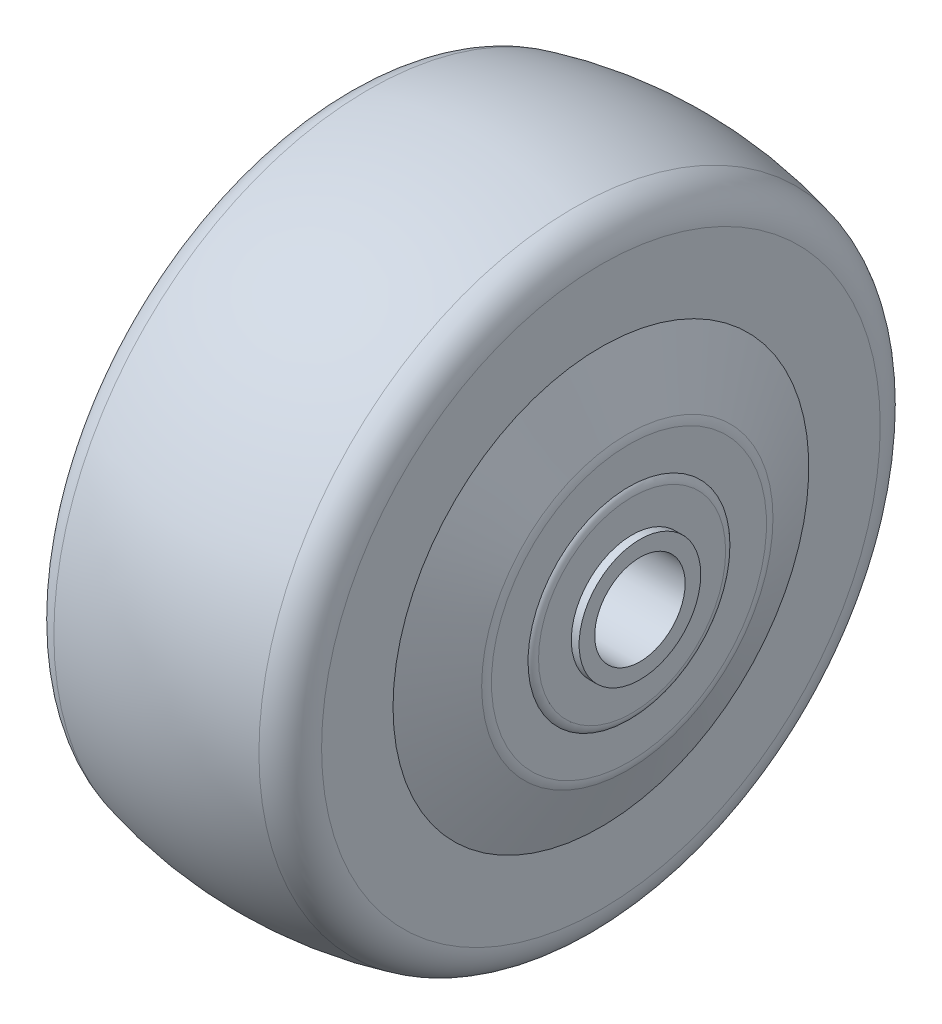
ISO-10303-21;
HEADER;
FILE_DESCRIPTION(('STEP AP214'),'2;1');
FILE_NAME('part.step','',(''),(''),'','','');
FILE_SCHEMA(('AUTOMOTIVE_DESIGN { 1 0 10303 214 1 1 1 1 }'));
ENDSEC;
DATA;
#1=APPLICATION_CONTEXT('core data for automotive mechanical design processes');
#2=APPLICATION_PROTOCOL_DEFINITION('international standard','automotive_design',2000,#1);
#3=PRODUCT_CONTEXT('',#1,'mechanical');
#4=PRODUCT('Part','Part','',(#3));
#5=PRODUCT_RELATED_PRODUCT_CATEGORY('part','',(#4));
#6=PRODUCT_DEFINITION_FORMATION('','',#4);
#7=PRODUCT_DEFINITION_CONTEXT('part definition',#1,'design');
#8=PRODUCT_DEFINITION('design','',#6,#7);
#9=PRODUCT_DEFINITION_SHAPE('','',#8);
#10=(LENGTH_UNIT() NAMED_UNIT(*) SI_UNIT(.MILLI.,.METRE.));
#11=(NAMED_UNIT(*) PLANE_ANGLE_UNIT() SI_UNIT($,.RADIAN.));
#12=(NAMED_UNIT(*) SI_UNIT($,.STERADIAN.) SOLID_ANGLE_UNIT());
#13=UNCERTAINTY_MEASURE_WITH_UNIT(LENGTH_MEASURE(1.E-05),#10,'distance_accuracy_value','');
#14=(GEOMETRIC_REPRESENTATION_CONTEXT(3) GLOBAL_UNCERTAINTY_ASSIGNED_CONTEXT((#13)) GLOBAL_UNIT_ASSIGNED_CONTEXT((#10,
#11,#12)) REPRESENTATION_CONTEXT('',''));
#15=CARTESIAN_POINT('',(0.,0.,0.));
#16=DIRECTION('',(0.,0.,1.));
#17=DIRECTION('',(1.,0.,0.));
#18=AXIS2_PLACEMENT_3D('',#15,#16,#17);
#19=CARTESIAN_POINT('',(-17.87209777356,0.,0.));
#20=DIRECTION('',(1.,0.,0.));
#21=DIRECTION('',(0.,0.,-1.));
#22=AXIS2_PLACEMENT_3D('',#19,#20,#21);
#23=CYLINDRICAL_SURFACE('',#22,4.35);
#24=CARTESIAN_POINT('',(16.25290222644,0.,0.));
#25=DIRECTION('',(1.,0.,0.));
#26=DIRECTION('',(0.,0.,-1.));
#27=AXIS2_PLACEMENT_3D('',#24,#25,#26);
#28=CIRCLE('',#27,4.35);
#29=CARTESIAN_POINT('',(16.25290222644,0.,-4.35));
#30=VERTEX_POINT('',#29);
#31=EDGE_CURVE('E357',#30,#30,#28,.F.);
#32=ORIENTED_EDGE('',*,*,#31,.F.);
#33=EDGE_LOOP('',(#32));
#34=FACE_BOUND('',#33,.T.);
#35=CARTESIAN_POINT('',(-16.24709777356,0.,0.));
#36=DIRECTION('',(1.,0.,0.));
#37=DIRECTION('',(0.,0.,-1.));
#38=AXIS2_PLACEMENT_3D('',#35,#36,#37);
#39=CIRCLE('',#38,4.35);
#40=CARTESIAN_POINT('',(-16.24709777356,0.,-4.35));
#41=VERTEX_POINT('',#40);
#42=EDGE_CURVE('E359',#41,#41,#39,.F.);
#43=ORIENTED_EDGE('',*,*,#42,.T.);
#44=EDGE_LOOP('',(#43));
#45=FACE_BOUND('',#44,.T.);
#46=ADVANCED_FACE('F17',(#34,#45),#23,.F.);
#47=CARTESIAN_POINT('',(-16.24709777356,0.,0.));
#48=DIRECTION('',(1.,0.,0.));
#49=DIRECTION('',(0.,0.,-1.));
#50=AXIS2_PLACEMENT_3D('',#47,#48,#49);
#51=PLANE('',#50);
#52=ORIENTED_EDGE('',*,*,#42,.F.);
#53=EDGE_LOOP('',(#52));
#54=FACE_BOUND('',#53,.T.);
#55=CARTESIAN_POINT('',(-16.24709777356,0.,0.));
#56=DIRECTION('',(1.,0.,0.));
#57=DIRECTION('',(0.,0.,-1.));
#58=AXIS2_PLACEMENT_3D('',#55,#56,#57);
#59=CIRCLE('',#58,5.85);
#60=CARTESIAN_POINT('',(-16.24709777356,0.,-5.85));
#61=VERTEX_POINT('',#60);
#62=EDGE_CURVE('E354',#61,#61,#59,.T.);
#63=ORIENTED_EDGE('',*,*,#62,.F.);
#64=EDGE_LOOP('',(#63));
#65=FACE_BOUND('',#64,.T.);
#66=ADVANCED_FACE('F165',(#54,#65),#51,.F.);
#67=CARTESIAN_POINT('',(16.25290222644,0.,0.));
#68=DIRECTION('',(1.,0.,0.));
#69=DIRECTION('',(0.,0.,-1.));
#70=AXIS2_PLACEMENT_3D('',#67,#68,#69);
#71=PLANE('',#70);
#72=ORIENTED_EDGE('',*,*,#31,.T.);
#73=EDGE_LOOP('',(#72));
#74=FACE_BOUND('',#73,.T.);
#75=CARTESIAN_POINT('',(16.25290222644,0.,0.));
#76=DIRECTION('',(1.,0.,0.));
#77=DIRECTION('',(0.,0.,-1.));
#78=AXIS2_PLACEMENT_3D('',#75,#76,#77);
#79=CIRCLE('',#78,5.85);
#80=CARTESIAN_POINT('',(16.25290222644,0.,-5.85));
#81=VERTEX_POINT('',#80);
#82=EDGE_CURVE('E351',#81,#81,#79,.F.);
#83=ORIENTED_EDGE('',*,*,#82,.F.);
#84=EDGE_LOOP('',(#83));
#85=FACE_BOUND('',#84,.T.);
#86=ADVANCED_FACE('F161',(#74,#85),#71,.T.);
#87=CARTESIAN_POINT('',(-17.87209777356,0.,0.));
#88=DIRECTION('',(1.,0.,0.));
#89=DIRECTION('',(0.,0.,-1.));
#90=AXIS2_PLACEMENT_3D('',#87,#88,#89);
#91=CYLINDRICAL_SURFACE('',#90,5.85);
#92=ORIENTED_EDGE('',*,*,#62,.T.);
#93=EDGE_LOOP('',(#92));
#94=FACE_BOUND('',#93,.T.);
#95=CARTESIAN_POINT('',(-15.5,0.,0.));
#96=DIRECTION('',(1.,0.,0.));
#97=DIRECTION('',(0.,0.,-1.));
#98=AXIS2_PLACEMENT_3D('',#95,#96,#97);
#99=CIRCLE('',#98,5.85);
#100=CARTESIAN_POINT('',(-15.5,0.,-5.85));
#101=VERTEX_POINT('',#100);
#102=EDGE_CURVE('E348',#101,#101,#99,.F.);
#103=ORIENTED_EDGE('',*,*,#102,.T.);
#104=EDGE_LOOP('',(#103));
#105=FACE_BOUND('',#104,.T.);
#106=ADVANCED_FACE('F157',(#94,#105),#91,.T.);
#107=CARTESIAN_POINT('',(-17.87209777356,0.,0.));
#108=DIRECTION('',(1.,0.,0.));
#109=DIRECTION('',(0.,0.,-1.));
#110=AXIS2_PLACEMENT_3D('',#107,#108,#109);
#111=CYLINDRICAL_SURFACE('',#110,5.85);
#112=CARTESIAN_POINT('',(15.5,0.,0.));
#113=DIRECTION('',(1.,0.,0.));
#114=DIRECTION('',(0.,0.,-1.));
#115=AXIS2_PLACEMENT_3D('',#112,#113,#114);
#116=CIRCLE('',#115,5.85);
#117=CARTESIAN_POINT('',(15.5,0.,-5.85));
#118=VERTEX_POINT('',#117);
#119=EDGE_CURVE('E74',#118,#118,#116,.F.);
#120=ORIENTED_EDGE('',*,*,#119,.F.);
#121=EDGE_LOOP('',(#120));
#122=FACE_BOUND('',#121,.T.);
#123=ORIENTED_EDGE('',*,*,#82,.T.);
#124=EDGE_LOOP('',(#123));
#125=FACE_BOUND('',#124,.T.);
#126=ADVANCED_FACE('F152',(#122,#125),#111,.T.);
#127=CARTESIAN_POINT('',(-15.5,0.,0.));
#128=DIRECTION('',(1.,0.,0.));
#129=DIRECTION('',(0.,0.,-1.));
#130=AXIS2_PLACEMENT_3D('',#127,#128,#129);
#131=PLANE('',#130);
#132=ORIENTED_EDGE('',*,*,#102,.F.);
#133=EDGE_LOOP('',(#132));
#134=FACE_BOUND('',#133,.T.);
#135=CARTESIAN_POINT('',(-15.5,0.,0.));
#136=DIRECTION('',(1.,0.,0.));
#137=DIRECTION('',(0.,-1.,0.));
#138=AXIS2_PLACEMENT_3D('',#135,#136,#137);
#139=CIRCLE('',#138,8.999999999983);
#140=CARTESIAN_POINT('',(-15.5,-8.9999999999817,0.));
#141=VERTEX_POINT('',#140);
#142=CARTESIAN_POINT('',(-15.5,8.9999999999817,0.));
#143=VERTEX_POINT('',#142);
#144=EDGE_CURVE('E72',#141,#143,#139,.T.);
#145=ORIENTED_EDGE('',*,*,#144,.F.);
#146=CARTESIAN_POINT('',(-15.5,0.,0.));
#147=DIRECTION('',(1.,0.,0.));
#148=DIRECTION('',(0.,1.,0.));
#149=AXIS2_PLACEMENT_3D('',#146,#147,#148);
#150=CIRCLE('',#149,8.999999999983);
#151=EDGE_CURVE('E67',#143,#141,#150,.T.);
#152=ORIENTED_EDGE('',*,*,#151,.F.);
#153=EDGE_LOOP('',(#145,#152));
#154=FACE_BOUND('',#153,.T.);
#155=ADVANCED_FACE('F71',(#134,#154),#131,.F.);
#156=CARTESIAN_POINT('',(15.5,0.,0.));
#157=DIRECTION('',(1.,0.,0.));
#158=DIRECTION('',(0.,0.,-1.));
#159=AXIS2_PLACEMENT_3D('',#156,#157,#158);
#160=PLANE('',#159);
#161=ORIENTED_EDGE('',*,*,#119,.T.);
#162=EDGE_LOOP('',(#161));
#163=FACE_BOUND('',#162,.T.);
#164=CARTESIAN_POINT('',(15.499999999997,0.,0.));
#165=DIRECTION('',(-1.,0.,0.));
#166=DIRECTION('',(0.,1.,0.));
#167=AXIS2_PLACEMENT_3D('',#164,#165,#166);
#168=CIRCLE('',#167,8.99999999982);
#169=CARTESIAN_POINT('',(15.4999999999982,8.9999999998252,0.));
#170=VERTEX_POINT('',#169);
#171=CARTESIAN_POINT('',(15.4999999999982,-8.9999999998252,0.));
#172=VERTEX_POINT('',#171);
#173=EDGE_CURVE('E114',#170,#172,#168,.T.);
#174=ORIENTED_EDGE('',*,*,#173,.F.);
#175=CARTESIAN_POINT('',(15.499999999997,0.,0.));
#176=DIRECTION('',(-1.,0.,0.));
#177=DIRECTION('',(0.,-1.,0.));
#178=AXIS2_PLACEMENT_3D('',#175,#176,#177);
#179=CIRCLE('',#178,8.99999999982);
#180=EDGE_CURVE('E80',#172,#170,#179,.T.);
#181=ORIENTED_EDGE('',*,*,#180,.F.);
#182=EDGE_LOOP('',(#174,#181));
#183=FACE_BOUND('',#182,.T.);
#184=ADVANCED_FACE('F101',(#163,#183),#160,.T.);
#185=CARTESIAN_POINT('',(-14.49999999997,0.,0.));
#186=DIRECTION('',(1.,0.,0.));
#187=DIRECTION('',(0.,-1.,0.));
#188=AXIS2_PLACEMENT_3D('',#185,#186,#187);
#189=TOROIDAL_SURFACE('',#188,8.99999999997,1.00000000003);
#190=ORIENTED_EDGE('',*,*,#151,.T.);
#191=ORIENTED_EDGE('',*,*,#144,.T.);
#192=EDGE_LOOP('',(#190,#191));
#193=FACE_BOUND('',#192,.T.);
#194=CARTESIAN_POINT('',(-15.2,0.,0.));
#195=DIRECTION('',(1.,0.,0.));
#196=DIRECTION('',(0.,0.,-1.));
#197=AXIS2_PLACEMENT_3D('',#194,#195,#196);
#198=CIRCLE('',#197,9.71414284283689);
#199=CARTESIAN_POINT('',(-15.2,0.,-9.71414284283689));
#200=VERTEX_POINT('',#199);
#201=EDGE_CURVE('E339',#200,#200,#198,.F.);
#202=ORIENTED_EDGE('',*,*,#201,.T.);
#203=EDGE_LOOP('',(#202));
#204=FACE_BOUND('',#203,.T.);
#205=ADVANCED_FACE('F78',(#193,#204),#189,.T.);
#206=CARTESIAN_POINT('',(14.49999999987,0.,0.));
#207=DIRECTION('',(1.,0.,0.));
#208=DIRECTION('',(0.,-1.,0.));
#209=AXIS2_PLACEMENT_3D('',#206,#207,#208);
#210=TOROIDAL_SURFACE('',#209,8.999999999872,1.000000000127);
#211=CARTESIAN_POINT('',(15.2,0.,0.));
#212=DIRECTION('',(1.,0.,0.));
#213=DIRECTION('',(0.,0.,-1.));
#214=AXIS2_PLACEMENT_3D('',#211,#212,#213);
#215=CIRCLE('',#214,9.71414284277669);
#216=CARTESIAN_POINT('',(15.2,0.,-9.71414284277669));
#217=VERTEX_POINT('',#216);
#218=EDGE_CURVE('E337',#217,#217,#215,.F.);
#219=ORIENTED_EDGE('',*,*,#218,.F.);
#220=EDGE_LOOP('',(#219));
#221=FACE_BOUND('',#220,.T.);
#222=ORIENTED_EDGE('',*,*,#173,.T.);
#223=ORIENTED_EDGE('',*,*,#180,.T.);
#224=EDGE_LOOP('',(#222,#223));
#225=FACE_BOUND('',#224,.T.);
#226=ADVANCED_FACE('F100',(#221,#225),#210,.T.);
#227=CARTESIAN_POINT('',(-15.2,0.,0.));
#228=DIRECTION('',(1.,0.,0.));
#229=DIRECTION('',(0.,0.,-1.));
#230=AXIS2_PLACEMENT_3D('',#227,#228,#229);
#231=PLANE('',#230);
#232=ORIENTED_EDGE('',*,*,#201,.F.);
#233=EDGE_LOOP('',(#232));
#234=FACE_BOUND('',#233,.T.);
#235=CARTESIAN_POINT('',(-15.200000000005,0.,0.));
#236=DIRECTION('',(1.,0.,0.));
#237=DIRECTION('',(0.,-1.,0.));
#238=AXIS2_PLACEMENT_3D('',#235,#236,#237);
#239=CIRCLE('',#238,13.23229401321);
#240=CARTESIAN_POINT('',(-15.200000000003,-13.232294013189,0.));
#241=VERTEX_POINT('',#240);
#242=CARTESIAN_POINT('',(-15.200000000003,13.232294013189,0.));
#243=VERTEX_POINT('',#242);
#244=EDGE_CURVE('E309',#241,#243,#239,.T.);
#245=ORIENTED_EDGE('',*,*,#244,.F.);
#246=CARTESIAN_POINT('',(-15.200000000005,0.,0.));
#247=DIRECTION('',(1.,0.,0.));
#248=DIRECTION('',(0.,1.,0.));
#249=AXIS2_PLACEMENT_3D('',#246,#247,#248);
#250=CIRCLE('',#249,13.23229401321);
#251=EDGE_CURVE('E319',#243,#241,#250,.T.);
#252=ORIENTED_EDGE('',*,*,#251,.F.);
#253=EDGE_LOOP('',(#245,#252));
#254=FACE_BOUND('',#253,.T.);
#255=ADVANCED_FACE('F285',(#234,#254),#231,.F.);
#256=CARTESIAN_POINT('',(15.2,0.,0.));
#257=DIRECTION('',(1.,0.,0.));
#258=DIRECTION('',(0.,0.,-1.));
#259=AXIS2_PLACEMENT_3D('',#256,#257,#258);
#260=PLANE('',#259);
#261=ORIENTED_EDGE('',*,*,#218,.T.);
#262=EDGE_LOOP('',(#261));
#263=FACE_BOUND('',#262,.T.);
#264=CARTESIAN_POINT('',(15.199999999995,0.,0.));
#265=DIRECTION('',(-1.,0.,0.));
#266=DIRECTION('',(0.,1.,0.));
#267=AXIS2_PLACEMENT_3D('',#264,#265,#266);
#268=CIRCLE('',#267,13.232294013);
#269=CARTESIAN_POINT('',(15.199999999997,13.232294013,0.));
#270=VERTEX_POINT('',#269);
#271=CARTESIAN_POINT('',(15.199999999997,-13.232294013,0.));
#272=VERTEX_POINT('',#271);
#273=EDGE_CURVE('E268',#270,#272,#268,.T.);
#274=ORIENTED_EDGE('',*,*,#273,.F.);
#275=CARTESIAN_POINT('',(15.199999999995,0.,0.));
#276=DIRECTION('',(-1.,0.,0.));
#277=DIRECTION('',(0.,-1.,0.));
#278=AXIS2_PLACEMENT_3D('',#275,#276,#277);
#279=CIRCLE('',#278,13.232294013);
#280=EDGE_CURVE('E235',#272,#270,#279,.T.);
#281=ORIENTED_EDGE('',*,*,#280,.F.);
#282=EDGE_LOOP('',(#274,#281));
#283=FACE_BOUND('',#282,.T.);
#284=ADVANCED_FACE('F277',(#263,#283),#260,.T.);
#285=CARTESIAN_POINT('',(-13.19999999796,0.,0.));
#286=DIRECTION('',(1.,0.,0.));
#287=DIRECTION('',(0.,-1.,0.));
#288=AXIS2_PLACEMENT_3D('',#285,#286,#287);
#289=TOROIDAL_SURFACE('',#288,13.232294013,2.000000002045);
#290=ORIENTED_EDGE('',*,*,#251,.T.);
#291=ORIENTED_EDGE('',*,*,#244,.T.);
#292=EDGE_LOOP('',(#290,#291));
#293=FACE_BOUND('',#292,.T.);
#294=CARTESIAN_POINT('',(-15.0410097065829,0.,0.));
#295=DIRECTION('',(1.,0.,0.));
#296=DIRECTION('',(0.,-1.,0.));
#297=AXIS2_PLACEMENT_3D('',#294,#295,#296);
#298=CIRCLE('',#297,14.0137562711712);
#299=CARTESIAN_POINT('',(-15.0410097065829,-14.0137562711712,0.));
#300=VERTEX_POINT('',#299);
#301=EDGE_CURVE('E266',#300,#300,#298,.T.);
#302=ORIENTED_EDGE('',*,*,#301,.F.);
#303=EDGE_LOOP('',(#302));
#304=FACE_BOUND('',#303,.T.);
#305=ADVANCED_FACE('F253',(#293,#304),#289,.T.);
#306=CARTESIAN_POINT('',(13.19999999795,0.,0.));
#307=DIRECTION('',(1.,0.,0.));
#308=DIRECTION('',(0.,-1.,0.));
#309=AXIS2_PLACEMENT_3D('',#306,#307,#308);
#310=TOROIDAL_SURFACE('',#309,13.232294013,2.000000002045);
#311=CARTESIAN_POINT('',(15.0410097066634,0.,0.));
#312=DIRECTION('',(-1.,0.,0.));
#313=DIRECTION('',(0.,1.,0.));
#314=AXIS2_PLACEMENT_3D('',#311,#312,#313);
#315=CIRCLE('',#314,14.0137562709815);
#316=CARTESIAN_POINT('',(15.0410097066634,14.0137562709815,0.));
#317=VERTEX_POINT('',#316);
#318=EDGE_CURVE('E264',#317,#317,#315,.T.);
#319=ORIENTED_EDGE('',*,*,#318,.F.);
#320=EDGE_LOOP('',(#319));
#321=FACE_BOUND('',#320,.T.);
#322=ORIENTED_EDGE('',*,*,#273,.T.);
#323=ORIENTED_EDGE('',*,*,#280,.T.);
#324=EDGE_LOOP('',(#322,#323));
#325=FACE_BOUND('',#324,.T.);
#326=ADVANCED_FACE('F241',(#321,#325),#310,.T.);
#327=CARTESIAN_POINT('',(-12.500000183364,0.,0.));
#328=DIRECTION('',(1.,0.,0.));
#329=DIRECTION('',(0.,0.,-1.));
#330=AXIS2_PLACEMENT_3D('',#327,#328,#329);
#331=CONICAL_SURFACE('',#330,19.9999995680234,1.16937059883598);
#332=ORIENTED_EDGE('',*,*,#301,.T.);
#333=EDGE_LOOP('',(#332));
#334=FACE_BOUND('',#333,.T.);
#335=CARTESIAN_POINT('',(-12.500000183364,0.,0.));
#336=DIRECTION('',(1.,0.,0.));
#337=DIRECTION('',(0.,0.,-1.));
#338=AXIS2_PLACEMENT_3D('',#335,#336,#337);
#339=CIRCLE('',#338,19.9999995680234);
#340=CARTESIAN_POINT('',(-12.500000183364,0.,-19.9999995680234));
#341=VERTEX_POINT('',#340);
#342=EDGE_CURVE('E344',#341,#341,#339,.F.);
#343=ORIENTED_EDGE('',*,*,#342,.T.);
#344=EDGE_LOOP('',(#343));
#345=FACE_BOUND('',#344,.T.);
#346=ADVANCED_FACE('F252',(#334,#345),#331,.T.);
#347=CARTESIAN_POINT('',(12.500000183364,0.,0.));
#348=DIRECTION('',(-1.,0.,0.));
#349=DIRECTION('',(0.,0.,1.));
#350=AXIS2_PLACEMENT_3D('',#347,#348,#349);
#351=CONICAL_SURFACE('',#350,19.9999995680234,1.16937059883598);
#352=CARTESIAN_POINT('',(12.500000183364,0.,0.));
#353=DIRECTION('',(-1.,0.,0.));
#354=DIRECTION('',(0.,0.,1.));
#355=AXIS2_PLACEMENT_3D('',#352,#353,#354);
#356=CIRCLE('',#355,19.9999995680234);
#357=CARTESIAN_POINT('',(12.500000183364,0.,19.9999995680234));
#358=VERTEX_POINT('',#357);
#359=EDGE_CURVE('E88',#358,#358,#356,.T.);
#360=ORIENTED_EDGE('',*,*,#359,.F.);
#361=EDGE_LOOP('',(#360));
#362=FACE_BOUND('',#361,.T.);
#363=ORIENTED_EDGE('',*,*,#318,.T.);
#364=EDGE_LOOP('',(#363));
#365=FACE_BOUND('',#364,.T.);
#366=ADVANCED_FACE('F413',(#362,#365),#351,.T.);
#367=CARTESIAN_POINT('',(-12.5,0.,0.));
#368=DIRECTION('',(1.,0.,0.));
#369=DIRECTION('',(0.,0.,-1.));
#370=AXIS2_PLACEMENT_3D('',#367,#368,#369);
#371=PLANE('',#370);
#372=ORIENTED_EDGE('',*,*,#342,.F.);
#373=EDGE_LOOP('',(#372));
#374=FACE_BOUND('',#373,.T.);
#375=CARTESIAN_POINT('',(-12.5,0.,0.));
#376=DIRECTION('',(1.,0.,0.));
#377=DIRECTION('',(0.,-1.,0.));
#378=AXIS2_PLACEMENT_3D('',#375,#376,#377);
#379=CIRCLE('',#378,26.87301130112);
#380=CARTESIAN_POINT('',(-12.5,-26.873011369604,0.));
#381=VERTEX_POINT('',#380);
#382=CARTESIAN_POINT('',(-12.5,26.873011369604,0.));
#383=VERTEX_POINT('',#382);
#384=EDGE_CURVE('E222',#381,#383,#379,.T.);
#385=ORIENTED_EDGE('',*,*,#384,.F.);
#386=CARTESIAN_POINT('',(-12.5,0.,0.));
#387=DIRECTION('',(1.,0.,0.));
#388=DIRECTION('',(0.,1.,0.));
#389=AXIS2_PLACEMENT_3D('',#386,#387,#388);
#390=CIRCLE('',#389,26.87301147233);
#391=EDGE_CURVE('E192',#383,#381,#390,.T.);
#392=ORIENTED_EDGE('',*,*,#391,.F.);
#393=EDGE_LOOP('',(#385,#392));
#394=FACE_BOUND('',#393,.T.);
#395=ADVANCED_FACE('F420',(#374,#394),#371,.F.);
#396=CARTESIAN_POINT('',(12.5,0.,0.));
#397=DIRECTION('',(1.,0.,0.));
#398=DIRECTION('',(0.,0.,-1.));
#399=AXIS2_PLACEMENT_3D('',#396,#397,#398);
#400=PLANE('',#399);
#401=ORIENTED_EDGE('',*,*,#359,.T.);
#402=EDGE_LOOP('',(#401));
#403=FACE_BOUND('',#402,.T.);
#404=CARTESIAN_POINT('',(12.499999999997,0.,0.));
#405=DIRECTION('',(-1.,0.,0.));
#406=DIRECTION('',(0.,1.,0.));
#407=AXIS2_PLACEMENT_3D('',#404,#405,#406);
#408=CIRCLE('',#407,26.87301130111);
#409=CARTESIAN_POINT('',(12.4999999999988,26.87301204855,0.));
#410=VERTEX_POINT('',#409);
#411=CARTESIAN_POINT('',(12.4999999999988,-26.87301204855,0.));
#412=VERTEX_POINT('',#411);
#413=EDGE_CURVE('E37',#410,#412,#408,.T.);
#414=ORIENTED_EDGE('',*,*,#413,.F.);
#415=CARTESIAN_POINT('',(12.4999999999985,0.,0.));
#416=DIRECTION('',(-1.,0.,0.));
#417=DIRECTION('',(0.,-1.,0.));
#418=AXIS2_PLACEMENT_3D('',#415,#416,#417);
#419=CIRCLE('',#418,26.87301316971);
#420=EDGE_CURVE('E190',#412,#410,#419,.T.);
#421=ORIENTED_EDGE('',*,*,#420,.F.);
#422=EDGE_LOOP('',(#414,#421));
#423=FACE_BOUND('',#422,.T.);
#424=ADVANCED_FACE('F427',(#403,#423),#400,.T.);
#425=CARTESIAN_POINT('',(-9.000000997927,0.,0.));
#426=DIRECTION('',(1.,0.,0.));
#427=DIRECTION('',(0.,-1.,0.));
#428=AXIS2_PLACEMENT_3D('',#425,#426,#427);
#429=TOROIDAL_SURFACE('',#428,26.87301164354,3.499999002073);
#430=CARTESIAN_POINT('',(-9.86301465667347,0.,-2.51946900842182E-12));
#431=DIRECTION('',(1.,0.,0.));
#432=DIRECTION('',(0.,0.998026728428276,-0.0627905195292367));
#433=AXIS2_PLACEMENT_3D('',#430,#431,#432);
#434=CIRCLE('',#433,30.2649433113834);
#435=CARTESIAN_POINT('',(-9.86301465667387,30.2052223591271,-1.90035151404718));
#436=VERTEX_POINT('',#435);
#437=EDGE_CURVE('E29',#436,#436,#434,.T.);
#438=ORIENTED_EDGE('',*,*,#437,.F.);
#439=EDGE_LOOP('',(#438));
#440=FACE_BOUND('',#439,.T.);
#441=ORIENTED_EDGE('',*,*,#391,.T.);
#442=ORIENTED_EDGE('',*,*,#384,.T.);
#443=EDGE_LOOP('',(#441,#442));
#444=FACE_BOUND('',#443,.T.);
#445=ADVANCED_FACE('F182',(#440,#444),#429,.T.);
#446=CARTESIAN_POINT('',(9.000005364593,0.,0.));
#447=DIRECTION('',(1.,0.,0.));
#448=DIRECTION('',(0.,-1.,0.));
#449=AXIS2_PLACEMENT_3D('',#446,#447,#448);
#450=TOROIDAL_SURFACE('',#449,26.87301503831,3.499994635406);
#451=ORIENTED_EDGE('',*,*,#413,.T.);
#452=ORIENTED_EDGE('',*,*,#420,.T.);
#453=EDGE_LOOP('',(#451,#452));
#454=FACE_BOUND('',#453,.T.);
#455=CARTESIAN_POINT('',(9.86302440735362,-1.54592463222215E-11,-1.0898291817607E-11));
#456=DIRECTION('',(-1.,0.,0.));
#457=DIRECTION('',(0.,0.998026728428297,-0.0627905195289085));
#458=AXIS2_PLACEMENT_3D('',#455,#456,#457);
#459=CIRCLE('',#458,30.2649408305146);
#460=CARTESIAN_POINT('',(9.86302440735401,30.205219883139,-1.90035135827059));
#461=VERTEX_POINT('',#460);
#462=EDGE_CURVE('E11',#461,#461,#459,.T.);
#463=ORIENTED_EDGE('',*,*,#462,.F.);
#464=EDGE_LOOP('',(#463));
#465=FACE_BOUND('',#464,.T.);
#466=ADVANCED_FACE('F177',(#454,#465),#450,.T.);
#467=CARTESIAN_POINT('',(-6.35602681597902E-12,0.,-2.98047177216265E-12));
#468=DIRECTION('',(1.,0.,0.));
#469=DIRECTION('',(0.,0.,-1.));
#470=AXIS2_PLACEMENT_3D('',#467,#468,#469);
#471=DEGENERATE_TOROIDAL_SURFACE('',#470,8.49995467917542,39.9999546791747,.F.);
#472=ORIENTED_EDGE('',*,*,#462,.T.);
#473=EDGE_LOOP('',(#472));
#474=FACE_BOUND('',#473,.T.);
#475=ORIENTED_EDGE('',*,*,#437,.T.);
#476=EDGE_LOOP('',(#475));
#477=FACE_BOUND('',#476,.T.);
#478=ADVANCED_FACE('F19',(#474,#477),#471,.F.);
#479=CLOSED_SHELL('',(#46,#66,#86,#106,#126,#155,#184,#205,#226,#255,#284,#305,#326,#346,#366,
#395,#424,#445,#466,#478));
#480=MANIFOLD_SOLID_BREP('B1',#479);
#481=ADVANCED_BREP_SHAPE_REPRESENTATION('',(#18,#480),#14);
#482=SHAPE_DEFINITION_REPRESENTATION(#9,#481);
ENDSEC;
END-ISO-10303-21;
